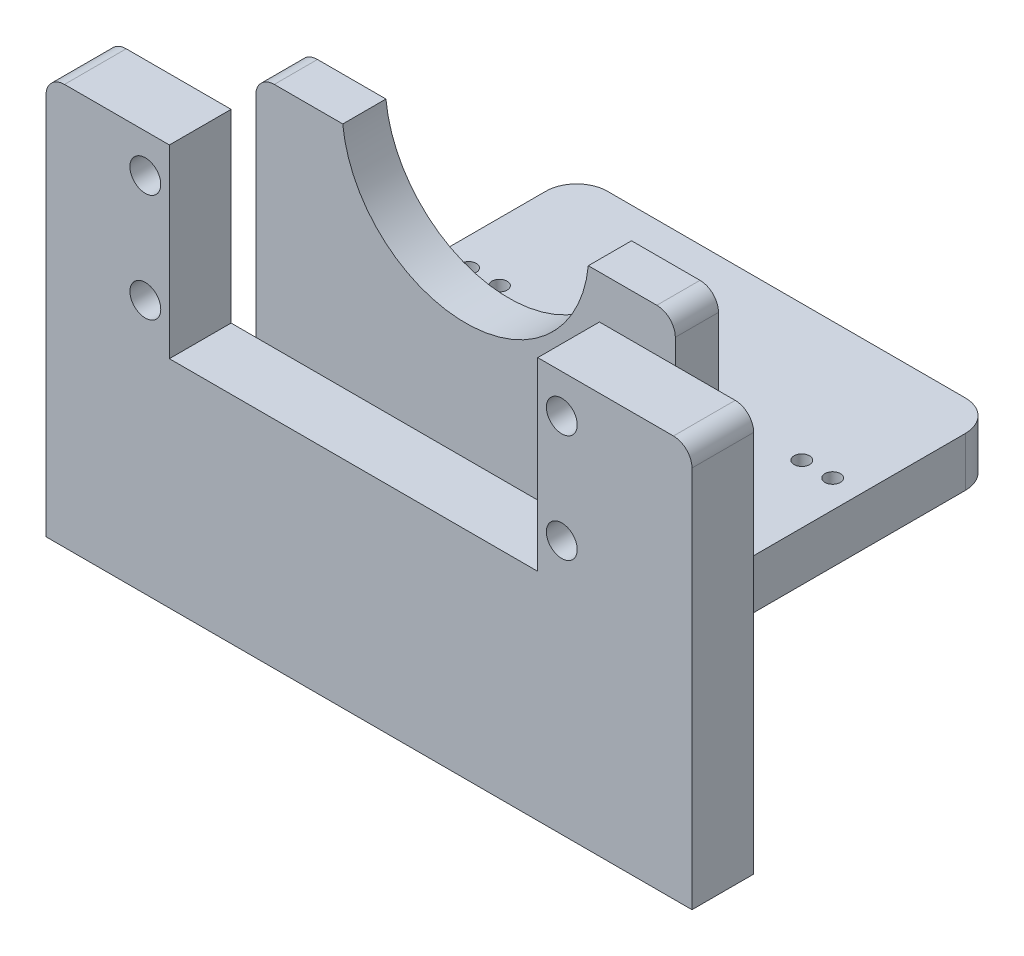
ISO-10303-21;
HEADER;
FILE_DESCRIPTION(('STEP AP214'),'2;1');
FILE_NAME('part.step','',(''),(''),'','','');
FILE_SCHEMA(('AUTOMOTIVE_DESIGN { 1 0 10303 214 1 1 1 1 }'));
ENDSEC;
DATA;
#1=APPLICATION_CONTEXT('core data for automotive mechanical design processes');
#2=APPLICATION_PROTOCOL_DEFINITION('international standard','automotive_design',2000,#1);
#3=PRODUCT_CONTEXT('',#1,'mechanical');
#4=PRODUCT('Part','Part','',(#3));
#5=PRODUCT_RELATED_PRODUCT_CATEGORY('part','',(#4));
#6=PRODUCT_DEFINITION_FORMATION('','',#4);
#7=PRODUCT_DEFINITION_CONTEXT('part definition',#1,'design');
#8=PRODUCT_DEFINITION('design','',#6,#7);
#9=PRODUCT_DEFINITION_SHAPE('','',#8);
#10=(LENGTH_UNIT() NAMED_UNIT(*) SI_UNIT(.MILLI.,.METRE.));
#11=(NAMED_UNIT(*) PLANE_ANGLE_UNIT() SI_UNIT($,.RADIAN.));
#12=(NAMED_UNIT(*) SI_UNIT($,.STERADIAN.) SOLID_ANGLE_UNIT());
#13=UNCERTAINTY_MEASURE_WITH_UNIT(LENGTH_MEASURE(1.E-05),#10,'distance_accuracy_value','');
#14=(GEOMETRIC_REPRESENTATION_CONTEXT(3) GLOBAL_UNCERTAINTY_ASSIGNED_CONTEXT((#13)) GLOBAL_UNIT_ASSIGNED_CONTEXT((#10,
#11,#12)) REPRESENTATION_CONTEXT('',''));
#15=CARTESIAN_POINT('',(0.,0.,0.));
#16=DIRECTION('',(0.,0.,1.));
#17=DIRECTION('',(1.,0.,0.));
#18=AXIS2_PLACEMENT_3D('',#15,#16,#17);
#19=CARTESIAN_POINT('',(-30.4771972470644,6.0271819238043,-31.));
#20=DIRECTION('',(0.,0.,1.));
#21=DIRECTION('',(1.,0.,0.));
#22=AXIS2_PLACEMENT_3D('',#19,#20,#21);
#23=PLANE('',#22);
#24=DIRECTION('',(0.,-1.,0.));
#25=VECTOR('',#24,1.);
#26=CARTESIAN_POINT('',(-30.4771972470644,6.0271819238043,-31.));
#27=LINE('',#26,#25);
#28=CARTESIAN_POINT('',(-30.4771972470644,3.0271819238043,-31.));
#29=VERTEX_POINT('',#28);
#30=CARTESIAN_POINT('',(-30.4771972470644,-33.9728180761957,-31.));
#31=VERTEX_POINT('',#30);
#32=EDGE_CURVE('E258',#29,#31,#27,.T.);
#33=ORIENTED_EDGE('',*,*,#32,.F.);
#34=CARTESIAN_POINT('',(-27.4771972470644,3.0271819238043,-31.));
#35=DIRECTION('',(0.,0.,1.));
#36=DIRECTION('',(1.,0.,0.));
#37=AXIS2_PLACEMENT_3D('',#34,#35,#36);
#38=CIRCLE('',#37,3.);
#39=CARTESIAN_POINT('',(-27.4771972470644,6.0271819238043,-31.));
#40=VERTEX_POINT('',#39);
#41=EDGE_CURVE('E409',#29,#40,#38,.F.);
#42=ORIENTED_EDGE('',*,*,#41,.T.);
#43=DIRECTION('',(-1.,0.,0.));
#44=VECTOR('',#43,1.);
#45=CARTESIAN_POINT('',(-30.4771972470644,6.0271819238043,-31.));
#46=LINE('',#45,#44);
#47=CARTESIAN_POINT('',(-16.3769459891968,6.0271819238043,-31.));
#48=VERTEX_POINT('',#47);
#49=EDGE_CURVE('E254',#48,#40,#46,.T.);
#50=ORIENTED_EDGE('',*,*,#49,.F.);
#51=CARTESIAN_POINT('',(3.52280275293562,8.0271819238043,-31.));
#52=DIRECTION('',(0.,0.,1.));
#53=DIRECTION('',(1.,0.,0.));
#54=AXIS2_PLACEMENT_3D('',#51,#52,#53);
#55=CIRCLE('',#54,20.);
#56=CARTESIAN_POINT('',(23.422551495068,6.0271819238043,-31.));
#57=VERTEX_POINT('',#56);
#58=EDGE_CURVE('E248',#48,#57,#55,.T.);
#59=ORIENTED_EDGE('',*,*,#58,.T.);
#60=CARTESIAN_POINT('',(34.522551495068,6.0271819238043,-31.));
#61=VERTEX_POINT('',#60);
#62=EDGE_CURVE('E256',#61,#57,#46,.T.);
#63=ORIENTED_EDGE('',*,*,#62,.F.);
#64=CARTESIAN_POINT('',(34.522551495068,3.0271819238043,-31.));
#65=DIRECTION('',(0.,0.,1.));
#66=DIRECTION('',(1.,0.,0.));
#67=AXIS2_PLACEMENT_3D('',#64,#65,#66);
#68=CIRCLE('',#67,3.);
#69=CARTESIAN_POINT('',(37.522551495068,3.0271819238043,-31.));
#70=VERTEX_POINT('',#69);
#71=EDGE_CURVE('E50',#61,#70,#68,.F.);
#72=ORIENTED_EDGE('',*,*,#71,.T.);
#73=DIRECTION('',(0.,-1.,0.));
#74=VECTOR('',#73,1.);
#75=CARTESIAN_POINT('',(37.522551495068,6.0271819238043,-31.));
#76=LINE('',#75,#74);
#77=CARTESIAN_POINT('',(37.522551495068,-33.9728180761957,-31.));
#78=VERTEX_POINT('',#77);
#79=EDGE_CURVE('E196',#70,#78,#76,.T.);
#80=ORIENTED_EDGE('',*,*,#79,.T.);
#81=DIRECTION('',(1.,0.,0.));
#82=VECTOR('',#81,1.);
#83=CARTESIAN_POINT('',(37.522551495068,-33.9728180761957,-31.));
#84=LINE('',#83,#82);
#85=EDGE_CURVE('E200',#31,#78,#84,.T.);
#86=ORIENTED_EDGE('',*,*,#85,.F.);
#87=EDGE_LOOP('',(#33,#42,#50,#59,#63,#72,#80,#86));
#88=FACE_BOUND('',#87,.T.);
#89=ADVANCED_FACE('F35',(#88),#23,.F.);
#90=CARTESIAN_POINT('',(0.,6.0271819238043,0.));
#91=DIRECTION('',(0.,1.,0.));
#92=DIRECTION('',(0.,0.,1.));
#93=AXIS2_PLACEMENT_3D('',#90,#91,#92);
#94=PLANE('',#93);
#95=ORIENTED_EDGE('',*,*,#49,.T.);
#96=DIRECTION('',(0.,0.,1.));
#97=VECTOR('',#96,1.);
#98=CARTESIAN_POINT('',(-27.4771972470644,6.0271819238043,0.));
#99=LINE('',#98,#97);
#100=CARTESIAN_POINT('',(-27.4771972470644,6.0271819238043,-24.));
#101=VERTEX_POINT('',#100);
#102=EDGE_CURVE('E399',#40,#101,#99,.T.);
#103=ORIENTED_EDGE('',*,*,#102,.T.);
#104=DIRECTION('',(1.,0.,0.));
#105=VECTOR('',#104,1.);
#106=CARTESIAN_POINT('',(-30.4771972470644,6.0271819238043,-24.));
#107=LINE('',#106,#105);
#108=CARTESIAN_POINT('',(-16.3769459891968,6.0271819238043,-24.));
#109=VERTEX_POINT('',#108);
#110=EDGE_CURVE('E252',#101,#109,#107,.T.);
#111=ORIENTED_EDGE('',*,*,#110,.T.);
#112=DIRECTION('',(0.,0.,1.));
#113=VECTOR('',#112,1.);
#114=CARTESIAN_POINT('',(-16.3769459891968,6.0271819238043,-45.));
#115=LINE('',#114,#113);
#116=EDGE_CURVE('E351',#48,#109,#115,.T.);
#117=ORIENTED_EDGE('',*,*,#116,.F.);
#118=EDGE_LOOP('',(#95,#103,#111,#117));
#119=FACE_BOUND('',#118,.T.);
#120=ADVANCED_FACE('F492',(#119),#94,.T.);
#121=CARTESIAN_POINT('',(74.2228027529356,-33.9728180761957,-45.));
#122=DIRECTION('',(0.,-1.,0.));
#123=DIRECTION('',(0.,0.,-1.));
#124=AXIS2_PLACEMENT_3D('',#121,#122,#123);
#125=PLANE('',#124);
#126=DIRECTION('',(1.,0.,0.));
#127=VECTOR('',#126,1.);
#128=CARTESIAN_POINT('',(74.2228027529356,-33.9728180761957,0.));
#129=LINE('',#128,#127);
#130=CARTESIAN_POINT('',(-30.4771972470644,-33.9728180761957,0.));
#131=VERTEX_POINT('',#130);
#132=CARTESIAN_POINT('',(74.2228027529356,-33.9728180761957,0.));
#133=VERTEX_POINT('',#132);
#134=EDGE_CURVE('E264',#131,#133,#129,.T.);
#135=ORIENTED_EDGE('',*,*,#134,.T.);
#136=DIRECTION('',(-0.925206505756551,0.,-0.379463992634023));
#137=VECTOR('',#136,1.);
#138=CARTESIAN_POINT('',(58.4240877920947,-33.9728180761957,-6.47968147675893));
#139=LINE('',#138,#137);
#140=CARTESIAN_POINT('',(40.6252315318979,-33.9728180761957,-13.7797004658067));
#141=VERTEX_POINT('',#140);
#142=EDGE_CURVE('E243',#133,#141,#139,.T.);
#143=ORIENTED_EDGE('',*,*,#142,.T.);
#144=CARTESIAN_POINT('',(42.522551495068,-33.9728180761957,-18.4057329945895));
#145=DIRECTION('',(0.,-1.,0.));
#146=DIRECTION('',(0.,0.,-1.));
#147=AXIS2_PLACEMENT_3D('',#144,#145,#146);
#148=CIRCLE('',#147,5.);
#149=CARTESIAN_POINT('',(37.522551495068,-33.9728180761957,-18.4057329945895));
#150=VERTEX_POINT('',#149);
#151=EDGE_CURVE('E378',#141,#150,#148,.T.);
#152=ORIENTED_EDGE('',*,*,#151,.T.);
#153=DIRECTION('',(0.,0.,-1.));
#154=VECTOR('',#153,1.);
#155=CARTESIAN_POINT('',(37.522551495068,-33.9728180761957,-45.));
#156=LINE('',#155,#154);
#157=CARTESIAN_POINT('',(37.522551495068,-33.9728180761957,-24.));
#158=VERTEX_POINT('',#157);
#159=EDGE_CURVE('E241',#150,#158,#156,.T.);
#160=ORIENTED_EDGE('',*,*,#159,.T.);
#161=DIRECTION('',(1.,0.,0.));
#162=VECTOR('',#161,1.);
#163=CARTESIAN_POINT('',(-30.4771972470644,-33.9728180761957,-24.));
#164=LINE('',#163,#162);
#165=CARTESIAN_POINT('',(-30.4771972470644,-33.9728180761957,-24.));
#166=VERTEX_POINT('',#165);
#167=EDGE_CURVE('E251',#166,#158,#164,.T.);
#168=ORIENTED_EDGE('',*,*,#167,.F.);
#169=DIRECTION('',(0.,0.,1.));
#170=VECTOR('',#169,1.);
#171=CARTESIAN_POINT('',(-30.4771972470644,-33.9728180761957,-45.));
#172=LINE('',#171,#170);
#173=EDGE_CURVE('E267',#166,#131,#172,.T.);
#174=ORIENTED_EDGE('',*,*,#173,.T.);
#175=EDGE_LOOP('',(#135,#143,#152,#160,#168,#174));
#176=FACE_BOUND('',#175,.T.);
#177=ADVANCED_FACE('F421',(#176),#125,.F.);
#178=CARTESIAN_POINT('',(0.,0.,0.));
#179=DIRECTION('',(0.,0.,1.));
#180=DIRECTION('',(1.,0.,0.));
#181=AXIS2_PLACEMENT_3D('',#178,#179,#180);
#182=PLANE('',#181);
#183=CARTESIAN_POINT('',(53.1228027529356,-0.722818076195696,0.));
#184=DIRECTION('',(0.,0.,1.));
#185=DIRECTION('',(1.,0.,0.));
#186=AXIS2_PLACEMENT_3D('',#183,#184,#185);
#187=CIRCLE('',#186,2.5);
#188=CARTESIAN_POINT('',(55.6228027529356,-0.722818076195696,0.));
#189=VERTEX_POINT('',#188);
#190=EDGE_CURVE('E274',#189,#189,#187,.F.);
#191=ORIENTED_EDGE('',*,*,#190,.F.);
#192=EDGE_LOOP('',(#191));
#193=FACE_BOUND('',#192,.T.);
#194=CARTESIAN_POINT('',(53.1228027529356,16.7771819238043,0.));
#195=DIRECTION('',(0.,0.,1.));
#196=DIRECTION('',(1.,0.,0.));
#197=AXIS2_PLACEMENT_3D('',#194,#195,#196);
#198=CIRCLE('',#197,2.5);
#199=CARTESIAN_POINT('',(55.6228027529356,16.7771819238043,0.));
#200=VERTEX_POINT('',#199);
#201=EDGE_CURVE('E328',#200,#200,#198,.T.);
#202=ORIENTED_EDGE('',*,*,#201,.T.);
#203=EDGE_LOOP('',(#202));
#204=FACE_BOUND('',#203,.T.);
#205=CARTESIAN_POINT('',(-14.3771972470644,-0.722818076195696,0.));
#206=DIRECTION('',(0.,0.,1.));
#207=DIRECTION('',(1.,0.,0.));
#208=AXIS2_PLACEMENT_3D('',#205,#206,#207);
#209=CIRCLE('',#208,2.5);
#210=CARTESIAN_POINT('',(-11.8771972470644,-0.722818076195696,0.));
#211=VERTEX_POINT('',#210);
#212=EDGE_CURVE('E325',#211,#211,#209,.T.);
#213=ORIENTED_EDGE('',*,*,#212,.T.);
#214=EDGE_LOOP('',(#213));
#215=FACE_BOUND('',#214,.T.);
#216=CARTESIAN_POINT('',(-14.3771972470644,16.7771819238043,0.));
#217=DIRECTION('',(0.,0.,1.));
#218=DIRECTION('',(1.,0.,0.));
#219=AXIS2_PLACEMENT_3D('',#216,#217,#218);
#220=CIRCLE('',#219,2.5);
#221=CARTESIAN_POINT('',(-11.8771972470644,16.7771819238043,0.));
#222=VERTEX_POINT('',#221);
#223=EDGE_CURVE('E269',#222,#222,#220,.F.);
#224=ORIENTED_EDGE('',*,*,#223,.F.);
#225=EDGE_LOOP('',(#224));
#226=FACE_BOUND('',#225,.T.);
#227=DIRECTION('',(-1.,0.,0.));
#228=VECTOR('',#227,1.);
#229=CARTESIAN_POINT('',(0.,23.0271819238043,0.));
#230=LINE('',#229,#228);
#231=CARTESIAN_POINT('',(71.2228027529356,23.0271819238043,0.));
#232=VERTEX_POINT('',#231);
#233=CARTESIAN_POINT('',(49.2228027529356,23.0271819238043,0.));
#234=VERTEX_POINT('',#233);
#235=EDGE_CURVE('E323',#232,#234,#230,.T.);
#236=ORIENTED_EDGE('',*,*,#235,.F.);
#237=CARTESIAN_POINT('',(71.2228027529356,20.0271819238043,0.));
#238=DIRECTION('',(0.,0.,1.));
#239=DIRECTION('',(1.,0.,0.));
#240=AXIS2_PLACEMENT_3D('',#237,#238,#239);
#241=CIRCLE('',#240,3.);
#242=CARTESIAN_POINT('',(74.2228027529356,20.0271819238043,0.));
#243=VERTEX_POINT('',#242);
#244=EDGE_CURVE('E359',#232,#243,#241,.F.);
#245=ORIENTED_EDGE('',*,*,#244,.T.);
#246=DIRECTION('',(0.,-1.,0.));
#247=VECTOR('',#246,1.);
#248=CARTESIAN_POINT('',(74.2228027529356,0.,0.));
#249=LINE('',#248,#247);
#250=EDGE_CURVE('E321',#243,#133,#249,.T.);
#251=ORIENTED_EDGE('',*,*,#250,.T.);
#252=ORIENTED_EDGE('',*,*,#134,.F.);
#253=DIRECTION('',(0.,1.,0.));
#254=VECTOR('',#253,1.);
#255=CARTESIAN_POINT('',(-30.4771972470644,0.,0.));
#256=LINE('',#255,#254);
#257=CARTESIAN_POINT('',(-30.4771972470644,20.0271819238043,0.));
#258=VERTEX_POINT('',#257);
#259=EDGE_CURVE('E318',#131,#258,#256,.T.);
#260=ORIENTED_EDGE('',*,*,#259,.T.);
#261=CARTESIAN_POINT('',(-27.4771972470644,20.0271819238043,0.));
#262=DIRECTION('',(0.,0.,1.));
#263=DIRECTION('',(1.,0.,0.));
#264=AXIS2_PLACEMENT_3D('',#261,#262,#263);
#265=CIRCLE('',#264,3.);
#266=CARTESIAN_POINT('',(-27.4771972470644,23.0271819238043,0.));
#267=VERTEX_POINT('',#266);
#268=EDGE_CURVE('E357',#258,#267,#265,.F.);
#269=ORIENTED_EDGE('',*,*,#268,.T.);
#270=DIRECTION('',(1.,0.,0.));
#271=VECTOR('',#270,1.);
#272=CARTESIAN_POINT('',(0.,23.0271819238043,0.));
#273=LINE('',#272,#271);
#274=CARTESIAN_POINT('',(-10.4771972470644,23.0271819238043,0.));
#275=VERTEX_POINT('',#274);
#276=EDGE_CURVE('E316',#267,#275,#273,.T.);
#277=ORIENTED_EDGE('',*,*,#276,.T.);
#278=DIRECTION('',(0.,-1.,0.));
#279=VECTOR('',#278,1.);
#280=CARTESIAN_POINT('',(-10.4771972470644,0.,0.));
#281=LINE('',#280,#279);
#282=CARTESIAN_POINT('',(-10.4771972470644,-6.9728180761957,0.));
#283=VERTEX_POINT('',#282);
#284=EDGE_CURVE('E313',#275,#283,#281,.T.);
#285=ORIENTED_EDGE('',*,*,#284,.T.);
#286=DIRECTION('',(1.,0.,0.));
#287=VECTOR('',#286,1.);
#288=CARTESIAN_POINT('',(0.,-6.9728180761957,0.));
#289=LINE('',#288,#287);
#290=CARTESIAN_POINT('',(49.2228027529356,-6.9728180761957,0.));
#291=VERTEX_POINT('',#290);
#292=EDGE_CURVE('E310',#283,#291,#289,.T.);
#293=ORIENTED_EDGE('',*,*,#292,.T.);
#294=DIRECTION('',(0.,1.,0.));
#295=VECTOR('',#294,1.);
#296=CARTESIAN_POINT('',(49.2228027529356,0.,0.));
#297=LINE('',#296,#295);
#298=EDGE_CURVE('E307',#291,#234,#297,.T.);
#299=ORIENTED_EDGE('',*,*,#298,.T.);
#300=EDGE_LOOP('',(#236,#245,#251,#252,#260,#269,#277,#285,#293,#299));
#301=FACE_BOUND('',#300,.T.);
#302=ADVANCED_FACE('F430',(#193,#204,#215,#226,#301),#182,.F.);
#303=CARTESIAN_POINT('',(49.2228027529356,0.,10.));
#304=DIRECTION('',(-1.,0.,0.));
#305=DIRECTION('',(0.,0.,1.));
#306=AXIS2_PLACEMENT_3D('',#303,#304,#305);
#307=PLANE('',#306);
#308=ORIENTED_EDGE('',*,*,#298,.F.);
#309=DIRECTION('',(0.,0.,-1.));
#310=VECTOR('',#309,1.);
#311=CARTESIAN_POINT('',(49.2228027529356,-6.9728180761957,10.));
#312=LINE('',#311,#310);
#313=CARTESIAN_POINT('',(49.2228027529356,-6.9728180761957,10.));
#314=VERTEX_POINT('',#313);
#315=EDGE_CURVE('E346',#314,#291,#312,.T.);
#316=ORIENTED_EDGE('',*,*,#315,.F.);
#317=DIRECTION('',(0.,1.,0.));
#318=VECTOR('',#317,1.);
#319=CARTESIAN_POINT('',(49.2228027529356,0.,10.));
#320=LINE('',#319,#318);
#321=CARTESIAN_POINT('',(49.2228027529356,23.0271819238043,10.));
#322=VERTEX_POINT('',#321);
#323=EDGE_CURVE('E273',#314,#322,#320,.T.);
#324=ORIENTED_EDGE('',*,*,#323,.T.);
#325=DIRECTION('',(0.,0.,-1.));
#326=VECTOR('',#325,1.);
#327=CARTESIAN_POINT('',(49.2228027529356,23.0271819238043,10.));
#328=LINE('',#327,#326);
#329=EDGE_CURVE('E304',#322,#234,#328,.T.);
#330=ORIENTED_EDGE('',*,*,#329,.T.);
#331=EDGE_LOOP('',(#308,#316,#324,#330));
#332=FACE_BOUND('',#331,.T.);
#333=ADVANCED_FACE('F471',(#332),#307,.T.);
#334=CARTESIAN_POINT('',(0.,-6.9728180761957,10.));
#335=DIRECTION('',(0.,1.,0.));
#336=DIRECTION('',(0.,0.,1.));
#337=AXIS2_PLACEMENT_3D('',#334,#335,#336);
#338=PLANE('',#337);
#339=ORIENTED_EDGE('',*,*,#292,.F.);
#340=DIRECTION('',(0.,0.,-1.));
#341=VECTOR('',#340,1.);
#342=CARTESIAN_POINT('',(-10.4771972470644,-6.9728180761957,10.));
#343=LINE('',#342,#341);
#344=CARTESIAN_POINT('',(-10.4771972470644,-6.9728180761957,10.));
#345=VERTEX_POINT('',#344);
#346=EDGE_CURVE('E344',#345,#283,#343,.T.);
#347=ORIENTED_EDGE('',*,*,#346,.F.);
#348=DIRECTION('',(1.,0.,0.));
#349=VECTOR('',#348,1.);
#350=CARTESIAN_POINT('',(0.,-6.9728180761957,10.));
#351=LINE('',#350,#349);
#352=EDGE_CURVE('E277',#345,#314,#351,.T.);
#353=ORIENTED_EDGE('',*,*,#352,.T.);
#354=ORIENTED_EDGE('',*,*,#315,.T.);
#355=EDGE_LOOP('',(#339,#347,#353,#354));
#356=FACE_BOUND('',#355,.T.);
#357=ADVANCED_FACE('F469',(#356),#338,.T.);
#358=CARTESIAN_POINT('',(-10.4771972470644,0.,10.));
#359=DIRECTION('',(1.,0.,0.));
#360=DIRECTION('',(0.,1.,0.));
#361=AXIS2_PLACEMENT_3D('',#358,#359,#360);
#362=PLANE('',#361);
#363=ORIENTED_EDGE('',*,*,#284,.F.);
#364=DIRECTION('',(0.,0.,-1.));
#365=VECTOR('',#364,1.);
#366=CARTESIAN_POINT('',(-10.4771972470644,23.0271819238043,10.));
#367=LINE('',#366,#365);
#368=CARTESIAN_POINT('',(-10.4771972470644,23.0271819238043,10.));
#369=VERTEX_POINT('',#368);
#370=EDGE_CURVE('E341',#369,#275,#367,.T.);
#371=ORIENTED_EDGE('',*,*,#370,.F.);
#372=DIRECTION('',(0.,-1.,0.));
#373=VECTOR('',#372,1.);
#374=CARTESIAN_POINT('',(-10.4771972470644,0.,10.));
#375=LINE('',#374,#373);
#376=EDGE_CURVE('E280',#369,#345,#375,.T.);
#377=ORIENTED_EDGE('',*,*,#376,.T.);
#378=ORIENTED_EDGE('',*,*,#346,.T.);
#379=EDGE_LOOP('',(#363,#371,#377,#378));
#380=FACE_BOUND('',#379,.T.);
#381=ADVANCED_FACE('F465',(#380),#362,.T.);
#382=CARTESIAN_POINT('',(0.,23.0271819238043,10.));
#383=DIRECTION('',(0.,1.,0.));
#384=DIRECTION('',(-1.,0.,0.));
#385=AXIS2_PLACEMENT_3D('',#382,#383,#384);
#386=PLANE('',#385);
#387=ORIENTED_EDGE('',*,*,#276,.F.);
#388=DIRECTION('',(0.,0.,-1.));
#389=VECTOR('',#388,1.);
#390=CARTESIAN_POINT('',(-27.4771972470644,23.0271819238043,10.));
#391=LINE('',#390,#389);
#392=CARTESIAN_POINT('',(-27.4771972470644,23.0271819238043,10.));
#393=VERTEX_POINT('',#392);
#394=EDGE_CURVE('E370',#267,#393,#391,.F.);
#395=ORIENTED_EDGE('',*,*,#394,.T.);
#396=DIRECTION('',(1.,0.,0.));
#397=VECTOR('',#396,1.);
#398=CARTESIAN_POINT('',(0.,23.0271819238043,10.));
#399=LINE('',#398,#397);
#400=EDGE_CURVE('E283',#393,#369,#399,.T.);
#401=ORIENTED_EDGE('',*,*,#400,.T.);
#402=ORIENTED_EDGE('',*,*,#370,.T.);
#403=EDGE_LOOP('',(#387,#395,#401,#402));
#404=FACE_BOUND('',#403,.T.);
#405=ADVANCED_FACE('F458',(#404),#386,.T.);
#406=CARTESIAN_POINT('',(-30.4771972470644,0.,10.));
#407=DIRECTION('',(-1.,0.,0.));
#408=DIRECTION('',(0.,0.,1.));
#409=AXIS2_PLACEMENT_3D('',#406,#407,#408);
#410=PLANE('',#409);
#411=DIRECTION('',(0.,-1.,0.));
#412=VECTOR('',#411,1.);
#413=CARTESIAN_POINT('',(-30.4771972470644,6.0271819238043,-24.));
#414=LINE('',#413,#412);
#415=CARTESIAN_POINT('',(-30.4771972470644,3.0271819238043,-24.));
#416=VERTEX_POINT('',#415);
#417=EDGE_CURVE('E262',#416,#166,#414,.T.);
#418=ORIENTED_EDGE('',*,*,#417,.F.);
#419=DIRECTION('',(0.,0.,1.));
#420=VECTOR('',#419,1.);
#421=CARTESIAN_POINT('',(-30.4771972470644,3.0271819238043,10.));
#422=LINE('',#421,#420);
#423=EDGE_CURVE('E406',#416,#29,#422,.F.);
#424=ORIENTED_EDGE('',*,*,#423,.T.);
#425=ORIENTED_EDGE('',*,*,#32,.T.);
#426=DIRECTION('',(0.,0.,1.));
#427=VECTOR('',#426,1.);
#428=CARTESIAN_POINT('',(-30.4771972470644,-33.9728180761957,-76.));
#429=LINE('',#428,#427);
#430=CARTESIAN_POINT('',(-30.4771972470644,-33.9728180761957,-71.));
#431=VERTEX_POINT('',#430);
#432=EDGE_CURVE('E215',#431,#31,#429,.T.);
#433=ORIENTED_EDGE('',*,*,#432,.F.);
#434=DIRECTION('',(0.,1.,0.));
#435=VECTOR('',#434,1.);
#436=CARTESIAN_POINT('',(-30.4771972470644,0.,-71.));
#437=LINE('',#436,#435);
#438=CARTESIAN_POINT('',(-30.4771972470644,-41.9728180761957,-71.));
#439=VERTEX_POINT('',#438);
#440=EDGE_CURVE('E392',#431,#439,#437,.F.);
#441=ORIENTED_EDGE('',*,*,#440,.T.);
#442=DIRECTION('',(0.,0.,-1.));
#443=VECTOR('',#442,1.);
#444=CARTESIAN_POINT('',(-30.4771972470644,-41.9728180761957,10.));
#445=LINE('',#444,#443);
#446=CARTESIAN_POINT('',(-30.4771972470644,-41.9728180761957,10.));
#447=VERTEX_POINT('',#446);
#448=EDGE_CURVE('E338',#447,#439,#445,.T.);
#449=ORIENTED_EDGE('',*,*,#448,.F.);
#450=DIRECTION('',(0.,1.,0.));
#451=VECTOR('',#450,1.);
#452=CARTESIAN_POINT('',(-30.4771972470644,0.,10.));
#453=LINE('',#452,#451);
#454=CARTESIAN_POINT('',(-30.4771972470644,20.0271819238043,10.));
#455=VERTEX_POINT('',#454);
#456=EDGE_CURVE('E285',#447,#455,#453,.T.);
#457=ORIENTED_EDGE('',*,*,#456,.T.);
#458=DIRECTION('',(0.,0.,-1.));
#459=VECTOR('',#458,1.);
#460=CARTESIAN_POINT('',(-30.4771972470644,20.0271819238043,10.));
#461=LINE('',#460,#459);
#462=EDGE_CURVE('E367',#455,#258,#461,.T.);
#463=ORIENTED_EDGE('',*,*,#462,.T.);
#464=ORIENTED_EDGE('',*,*,#259,.F.);
#465=ORIENTED_EDGE('',*,*,#173,.F.);
#466=EDGE_LOOP('',(#418,#424,#425,#433,#441,#449,#457,#463,#464,#465));
#467=FACE_BOUND('',#466,.T.);
#468=ADVANCED_FACE('F425',(#467),#410,.T.);
#469=CARTESIAN_POINT('',(0.,-41.9728180761957,10.));
#470=DIRECTION('',(0.,-1.,0.));
#471=DIRECTION('',(1.,0.,0.));
#472=AXIS2_PLACEMENT_3D('',#469,#470,#471);
#473=PLANE('',#472);
#474=CARTESIAN_POINT('',(-20.9771972470644,-41.9728180761957,-54.));
#475=DIRECTION('',(0.,-1.,0.));
#476=DIRECTION('',(1.,0.,0.));
#477=AXIS2_PLACEMENT_3D('',#474,#475,#476);
#478=CIRCLE('',#477,1.25);
#479=CARTESIAN_POINT('',(-19.7271972470644,-41.9728180761957,-54.));
#480=VERTEX_POINT('',#479);
#481=EDGE_CURVE('E840',#480,#480,#478,.F.);
#482=ORIENTED_EDGE('',*,*,#481,.T.);
#483=EDGE_LOOP('',(#482));
#484=FACE_BOUND('',#483,.T.);
#485=CARTESIAN_POINT('',(33.0228027529356,-41.9728180761957,-54.));
#486=DIRECTION('',(0.,-1.,0.));
#487=DIRECTION('',(1.,0.,0.));
#488=AXIS2_PLACEMENT_3D('',#485,#486,#487);
#489=CIRCLE('',#488,1.25);
#490=CARTESIAN_POINT('',(34.2728027529356,-41.9728180761957,-54.));
#491=VERTEX_POINT('',#490);
#492=EDGE_CURVE('E848',#491,#491,#489,.F.);
#493=ORIENTED_EDGE('',*,*,#492,.T.);
#494=EDGE_LOOP('',(#493));
#495=FACE_BOUND('',#494,.T.);
#496=CARTESIAN_POINT('',(-25.9771972470644,-41.9728180761957,-54.));
#497=DIRECTION('',(0.,-1.,0.));
#498=DIRECTION('',(1.,0.,0.));
#499=AXIS2_PLACEMENT_3D('',#496,#497,#498);
#500=CIRCLE('',#499,1.25);
#501=CARTESIAN_POINT('',(-24.7271972470644,-41.9728180761957,-54.));
#502=VERTEX_POINT('',#501);
#503=EDGE_CURVE('E844',#502,#502,#500,.F.);
#504=ORIENTED_EDGE('',*,*,#503,.T.);
#505=EDGE_LOOP('',(#504));
#506=FACE_BOUND('',#505,.T.);
#507=CARTESIAN_POINT('',(28.0228027529356,-41.9728180761957,-54.));
#508=DIRECTION('',(0.,-1.,0.));
#509=DIRECTION('',(1.,0.,0.));
#510=AXIS2_PLACEMENT_3D('',#507,#508,#509);
#511=CIRCLE('',#510,1.25);
#512=CARTESIAN_POINT('',(29.2728027529356,-41.9728180761957,-54.));
#513=VERTEX_POINT('',#512);
#514=EDGE_CURVE('E833',#513,#513,#511,.F.);
#515=ORIENTED_EDGE('',*,*,#514,.T.);
#516=EDGE_LOOP('',(#515));
#517=FACE_BOUND('',#516,.T.);
#518=CARTESIAN_POINT('',(3.52280275293562,-41.9728180761957,-54.));
#519=DIRECTION('',(0.,-1.,0.));
#520=DIRECTION('',(1.,0.,0.));
#521=AXIS2_PLACEMENT_3D('',#518,#519,#520);
#522=CIRCLE('',#521,6.5);
#523=CARTESIAN_POINT('',(10.0228027529356,-41.9728180761957,-54.));
#524=VERTEX_POINT('',#523);
#525=EDGE_CURVE('E228',#524,#524,#522,.F.);
#526=ORIENTED_EDGE('',*,*,#525,.T.);
#527=EDGE_LOOP('',(#526));
#528=FACE_BOUND('',#527,.T.);
#529=ORIENTED_EDGE('',*,*,#448,.T.);
#530=CARTESIAN_POINT('',(-25.4771972470644,-41.9728180761957,-71.));
#531=DIRECTION('',(0.,-1.,0.));
#532=DIRECTION('',(1.,0.,0.));
#533=AXIS2_PLACEMENT_3D('',#530,#531,#532);
#534=CIRCLE('',#533,5.);
#535=CARTESIAN_POINT('',(-25.4771972470644,-41.9728180761957,-76.));
#536=VERTEX_POINT('',#535);
#537=EDGE_CURVE('E396',#439,#536,#534,.T.);
#538=ORIENTED_EDGE('',*,*,#537,.T.);
#539=DIRECTION('',(-1.,0.,0.));
#540=VECTOR('',#539,1.);
#541=CARTESIAN_POINT('',(37.522551495068,-41.9728180761957,-76.));
#542=LINE('',#541,#540);
#543=CARTESIAN_POINT('',(32.522551495068,-41.9728180761957,-76.));
#544=VERTEX_POINT('',#543);
#545=EDGE_CURVE('E222',#544,#536,#542,.T.);
#546=ORIENTED_EDGE('',*,*,#545,.F.);
#547=CARTESIAN_POINT('',(32.522551495068,-41.9728180761957,-71.));
#548=DIRECTION('',(0.,-1.,0.));
#549=DIRECTION('',(1.,0.,0.));
#550=AXIS2_PLACEMENT_3D('',#547,#548,#549);
#551=CIRCLE('',#550,5.);
#552=CARTESIAN_POINT('',(37.522551495068,-41.9728180761957,-71.));
#553=VERTEX_POINT('',#552);
#554=EDGE_CURVE('E394',#544,#553,#551,.T.);
#555=ORIENTED_EDGE('',*,*,#554,.T.);
#556=DIRECTION('',(0.,0.,1.));
#557=VECTOR('',#556,1.);
#558=CARTESIAN_POINT('',(37.522551495068,-41.9728180761957,-45.));
#559=LINE('',#558,#557);
#560=CARTESIAN_POINT('',(37.522551495068,-41.9728180761957,-18.4057329945895));
#561=VERTEX_POINT('',#560);
#562=EDGE_CURVE('E233',#553,#561,#559,.T.);
#563=ORIENTED_EDGE('',*,*,#562,.T.);
#564=CARTESIAN_POINT('',(42.522551495068,-41.9728180761957,-18.4057329945895));
#565=DIRECTION('',(0.,-1.,0.));
#566=DIRECTION('',(1.,0.,0.));
#567=AXIS2_PLACEMENT_3D('',#564,#565,#566);
#568=CIRCLE('',#567,5.);
#569=CARTESIAN_POINT('',(40.6252315318979,-41.9728180761957,-13.7797004658067));
#570=VERTEX_POINT('',#569);
#571=EDGE_CURVE('E380',#561,#570,#568,.F.);
#572=ORIENTED_EDGE('',*,*,#571,.T.);
#573=DIRECTION('',(0.925206505756551,0.,0.379463992634023));
#574=VECTOR('',#573,1.);
#575=CARTESIAN_POINT('',(37.522551495068,-41.9728180761957,-15.0522329732155));
#576=LINE('',#575,#574);
#577=CARTESIAN_POINT('',(74.2228027529356,-41.9728180761957,0.));
#578=VERTEX_POINT('',#577);
#579=EDGE_CURVE('E235',#570,#578,#576,.T.);
#580=ORIENTED_EDGE('',*,*,#579,.T.);
#581=DIRECTION('',(0.,0.,-1.));
#582=VECTOR('',#581,1.);
#583=CARTESIAN_POINT('',(74.2228027529356,-41.9728180761957,10.));
#584=LINE('',#583,#582);
#585=CARTESIAN_POINT('',(74.2228027529356,-41.9728180761957,10.));
#586=VERTEX_POINT('',#585);
#587=EDGE_CURVE('E335',#586,#578,#584,.T.);
#588=ORIENTED_EDGE('',*,*,#587,.F.);
#589=DIRECTION('',(-1.,0.,0.));
#590=VECTOR('',#589,1.);
#591=CARTESIAN_POINT('',(0.,-41.9728180761957,10.));
#592=LINE('',#591,#590);
#593=EDGE_CURVE('E288',#586,#447,#592,.T.);
#594=ORIENTED_EDGE('',*,*,#593,.T.);
#595=EDGE_LOOP('',(#529,#538,#546,#555,#563,#572,#580,#588,#594));
#596=FACE_BOUND('',#595,.T.);
#597=ADVANCED_FACE('F446',(#484,#495,#506,#517,#528,#596),#473,.T.);
#598=CARTESIAN_POINT('',(74.2228027529356,0.,10.));
#599=DIRECTION('',(1.,0.,0.));
#600=DIRECTION('',(0.,1.,0.));
#601=AXIS2_PLACEMENT_3D('',#598,#599,#600);
#602=PLANE('',#601);
#603=DIRECTION('',(0.,1.,0.));
#604=VECTOR('',#603,1.);
#605=CARTESIAN_POINT('',(74.2228027529356,-41.9728180761957,0.));
#606=LINE('',#605,#604);
#607=EDGE_CURVE('E205',#578,#133,#606,.T.);
#608=ORIENTED_EDGE('',*,*,#607,.T.);
#609=ORIENTED_EDGE('',*,*,#250,.F.);
#610=DIRECTION('',(0.,0.,-1.));
#611=VECTOR('',#610,1.);
#612=CARTESIAN_POINT('',(74.2228027529356,20.0271819238043,10.));
#613=LINE('',#612,#611);
#614=CARTESIAN_POINT('',(74.2228027529356,20.0271819238043,10.));
#615=VERTEX_POINT('',#614);
#616=EDGE_CURVE('E361',#243,#615,#613,.F.);
#617=ORIENTED_EDGE('',*,*,#616,.T.);
#618=DIRECTION('',(0.,-1.,0.));
#619=VECTOR('',#618,1.);
#620=CARTESIAN_POINT('',(74.2228027529356,0.,10.));
#621=LINE('',#620,#619);
#622=EDGE_CURVE('E291',#615,#586,#621,.T.);
#623=ORIENTED_EDGE('',*,*,#622,.T.);
#624=ORIENTED_EDGE('',*,*,#587,.T.);
#625=EDGE_LOOP('',(#608,#609,#617,#623,#624));
#626=FACE_BOUND('',#625,.T.);
#627=ADVANCED_FACE('F440',(#626),#602,.T.);
#628=CARTESIAN_POINT('',(53.1228027529356,16.7771819238043,10.));
#629=DIRECTION('',(0.,0.,-1.));
#630=DIRECTION('',(-1.,0.,0.));
#631=AXIS2_PLACEMENT_3D('',#628,#629,#630);
#632=CYLINDRICAL_SURFACE('',#631,2.5);
#633=CARTESIAN_POINT('',(53.1228027529356,16.7771819238043,10.));
#634=DIRECTION('',(0.,0.,1.));
#635=DIRECTION('',(1.,0.,0.));
#636=AXIS2_PLACEMENT_3D('',#633,#634,#635);
#637=CIRCLE('',#636,2.5);
#638=CARTESIAN_POINT('',(55.6228027529356,16.7771819238043,10.));
#639=VERTEX_POINT('',#638);
#640=EDGE_CURVE('E298',#639,#639,#637,.T.);
#641=ORIENTED_EDGE('',*,*,#640,.T.);
#642=EDGE_LOOP('',(#641));
#643=FACE_BOUND('',#642,.T.);
#644=ORIENTED_EDGE('',*,*,#201,.F.);
#645=EDGE_LOOP('',(#644));
#646=FACE_BOUND('',#645,.T.);
#647=ADVANCED_FACE('F515',(#643,#646),#632,.F.);
#648=CARTESIAN_POINT('',(-14.3771972470644,-0.722818076195696,10.));
#649=DIRECTION('',(0.,0.,-1.));
#650=DIRECTION('',(-1.,0.,0.));
#651=AXIS2_PLACEMENT_3D('',#648,#649,#650);
#652=CYLINDRICAL_SURFACE('',#651,2.5);
#653=CARTESIAN_POINT('',(-14.3771972470644,-0.722818076195696,10.));
#654=DIRECTION('',(0.,0.,1.));
#655=DIRECTION('',(1.,0.,0.));
#656=AXIS2_PLACEMENT_3D('',#653,#654,#655);
#657=CIRCLE('',#656,2.5);
#658=CARTESIAN_POINT('',(-11.8771972470644,-0.722818076195696,10.));
#659=VERTEX_POINT('',#658);
#660=EDGE_CURVE('E295',#659,#659,#657,.T.);
#661=ORIENTED_EDGE('',*,*,#660,.T.);
#662=EDGE_LOOP('',(#661));
#663=FACE_BOUND('',#662,.T.);
#664=ORIENTED_EDGE('',*,*,#212,.F.);
#665=EDGE_LOOP('',(#664));
#666=FACE_BOUND('',#665,.T.);
#667=ADVANCED_FACE('F518',(#663,#666),#652,.F.);
#668=CARTESIAN_POINT('',(0.,23.0271819238043,10.));
#669=DIRECTION('',(0.,-1.,0.));
#670=DIRECTION('',(0.,0.,-1.));
#671=AXIS2_PLACEMENT_3D('',#668,#669,#670);
#672=PLANE('',#671);
#673=DIRECTION('',(-1.,0.,0.));
#674=VECTOR('',#673,1.);
#675=CARTESIAN_POINT('',(0.,23.0271819238043,10.));
#676=LINE('',#675,#674);
#677=CARTESIAN_POINT('',(71.2228027529356,23.0271819238043,10.));
#678=VERTEX_POINT('',#677);
#679=EDGE_CURVE('E293',#678,#322,#676,.T.);
#680=ORIENTED_EDGE('',*,*,#679,.F.);
#681=DIRECTION('',(0.,0.,-1.));
#682=VECTOR('',#681,1.);
#683=CARTESIAN_POINT('',(71.2228027529356,23.0271819238043,0.));
#684=LINE('',#683,#682);
#685=EDGE_CURVE('E354',#678,#232,#684,.T.);
#686=ORIENTED_EDGE('',*,*,#685,.T.);
#687=ORIENTED_EDGE('',*,*,#235,.T.);
#688=ORIENTED_EDGE('',*,*,#329,.F.);
#689=EDGE_LOOP('',(#680,#686,#687,#688));
#690=FACE_BOUND('',#689,.T.);
#691=ADVANCED_FACE('F475',(#690),#672,.F.);
#692=CARTESIAN_POINT('',(-14.3771972470644,16.7771819238043,10.));
#693=DIRECTION('',(0.,0.,-1.));
#694=DIRECTION('',(-1.,0.,0.));
#695=AXIS2_PLACEMENT_3D('',#692,#693,#694);
#696=CYLINDRICAL_SURFACE('',#695,2.5);
#697=CARTESIAN_POINT('',(-14.3771972470644,16.7771819238043,10.));
#698=DIRECTION('',(0.,0.,1.));
#699=DIRECTION('',(1.,0.,0.));
#700=AXIS2_PLACEMENT_3D('',#697,#698,#699);
#701=CIRCLE('',#700,2.5);
#702=CARTESIAN_POINT('',(-11.8771972470644,16.7771819238043,10.));
#703=VERTEX_POINT('',#702);
#704=EDGE_CURVE('E270',#703,#703,#701,.F.);
#705=ORIENTED_EDGE('',*,*,#704,.F.);
#706=EDGE_LOOP('',(#705));
#707=FACE_BOUND('',#706,.T.);
#708=ORIENTED_EDGE('',*,*,#223,.T.);
#709=EDGE_LOOP('',(#708));
#710=FACE_BOUND('',#709,.T.);
#711=ADVANCED_FACE('F513',(#707,#710),#696,.F.);
#712=CARTESIAN_POINT('',(53.1228027529356,-0.722818076195696,10.));
#713=DIRECTION('',(0.,0.,-1.));
#714=DIRECTION('',(-1.,0.,0.));
#715=AXIS2_PLACEMENT_3D('',#712,#713,#714);
#716=CYLINDRICAL_SURFACE('',#715,2.5);
#717=CARTESIAN_POINT('',(53.1228027529356,-0.722818076195696,10.));
#718=DIRECTION('',(0.,0.,1.));
#719=DIRECTION('',(1.,0.,0.));
#720=AXIS2_PLACEMENT_3D('',#717,#718,#719);
#721=CIRCLE('',#720,2.5);
#722=CARTESIAN_POINT('',(55.6228027529356,-0.722818076195696,10.));
#723=VERTEX_POINT('',#722);
#724=EDGE_CURVE('E301',#723,#723,#721,.F.);
#725=ORIENTED_EDGE('',*,*,#724,.F.);
#726=EDGE_LOOP('',(#725));
#727=FACE_BOUND('',#726,.T.);
#728=ORIENTED_EDGE('',*,*,#190,.T.);
#729=EDGE_LOOP('',(#728));
#730=FACE_BOUND('',#729,.T.);
#731=ADVANCED_FACE('F506',(#727,#730),#716,.F.);
#732=CARTESIAN_POINT('',(0.,0.,10.));
#733=DIRECTION('',(0.,0.,1.));
#734=DIRECTION('',(1.,0.,0.));
#735=AXIS2_PLACEMENT_3D('',#732,#733,#734);
#736=PLANE('',#735);
#737=ORIENTED_EDGE('',*,*,#704,.T.);
#738=EDGE_LOOP('',(#737));
#739=FACE_BOUND('',#738,.T.);
#740=ORIENTED_EDGE('',*,*,#622,.F.);
#741=CARTESIAN_POINT('',(71.2228027529356,20.0271819238043,10.));
#742=DIRECTION('',(0.,0.,1.));
#743=DIRECTION('',(1.,0.,0.));
#744=AXIS2_PLACEMENT_3D('',#741,#742,#743);
#745=CIRCLE('',#744,3.);
#746=EDGE_CURVE('E365',#615,#678,#745,.T.);
#747=ORIENTED_EDGE('',*,*,#746,.T.);
#748=ORIENTED_EDGE('',*,*,#679,.T.);
#749=ORIENTED_EDGE('',*,*,#323,.F.);
#750=ORIENTED_EDGE('',*,*,#352,.F.);
#751=ORIENTED_EDGE('',*,*,#376,.F.);
#752=ORIENTED_EDGE('',*,*,#400,.F.);
#753=CARTESIAN_POINT('',(-27.4771972470644,20.0271819238043,10.));
#754=DIRECTION('',(0.,0.,1.));
#755=DIRECTION('',(1.,0.,0.));
#756=AXIS2_PLACEMENT_3D('',#753,#754,#755);
#757=CIRCLE('',#756,3.);
#758=EDGE_CURVE('E363',#393,#455,#757,.T.);
#759=ORIENTED_EDGE('',*,*,#758,.T.);
#760=ORIENTED_EDGE('',*,*,#456,.F.);
#761=ORIENTED_EDGE('',*,*,#593,.F.);
#762=EDGE_LOOP('',(#740,#747,#748,#749,#750,#751,#752,#759,#760,#761));
#763=FACE_BOUND('',#762,.T.);
#764=ORIENTED_EDGE('',*,*,#660,.F.);
#765=EDGE_LOOP('',(#764));
#766=FACE_BOUND('',#765,.T.);
#767=ORIENTED_EDGE('',*,*,#640,.F.);
#768=EDGE_LOOP('',(#767));
#769=FACE_BOUND('',#768,.T.);
#770=ORIENTED_EDGE('',*,*,#724,.T.);
#771=EDGE_LOOP('',(#770));
#772=FACE_BOUND('',#771,.T.);
#773=ADVANCED_FACE('F449',(#739,#763,#766,#769,#772),#736,.T.);
#774=CARTESIAN_POINT('',(-30.4771972470644,6.0271819238043,-24.));
#775=DIRECTION('',(0.,0.,-1.));
#776=DIRECTION('',(-1.,0.,0.));
#777=AXIS2_PLACEMENT_3D('',#774,#775,#776);
#778=PLANE('',#777);
#779=ORIENTED_EDGE('',*,*,#110,.F.);
#780=CARTESIAN_POINT('',(-27.4771972470644,3.0271819238043,-24.));
#781=DIRECTION('',(0.,0.,-1.));
#782=DIRECTION('',(-1.,0.,0.));
#783=AXIS2_PLACEMENT_3D('',#780,#781,#782);
#784=CIRCLE('',#783,3.);
#785=EDGE_CURVE('E404',#101,#416,#784,.F.);
#786=ORIENTED_EDGE('',*,*,#785,.T.);
#787=ORIENTED_EDGE('',*,*,#417,.T.);
#788=ORIENTED_EDGE('',*,*,#167,.T.);
#789=DIRECTION('',(0.,1.,0.));
#790=VECTOR('',#789,1.);
#791=CARTESIAN_POINT('',(37.522551495068,6.0271819238043,-24.));
#792=LINE('',#791,#790);
#793=CARTESIAN_POINT('',(37.522551495068,3.0271819238043,-24.));
#794=VERTEX_POINT('',#793);
#795=EDGE_CURVE('E204',#158,#794,#792,.T.);
#796=ORIENTED_EDGE('',*,*,#795,.T.);
#797=CARTESIAN_POINT('',(34.522551495068,3.0271819238043,-24.));
#798=DIRECTION('',(0.,0.,-1.));
#799=DIRECTION('',(-1.,0.,0.));
#800=AXIS2_PLACEMENT_3D('',#797,#798,#799);
#801=CIRCLE('',#800,3.);
#802=CARTESIAN_POINT('',(34.522551495068,6.0271819238043,-24.));
#803=VERTEX_POINT('',#802);
#804=EDGE_CURVE('E402',#794,#803,#801,.F.);
#805=ORIENTED_EDGE('',*,*,#804,.T.);
#806=CARTESIAN_POINT('',(23.422551495068,6.0271819238043,-24.));
#807=VERTEX_POINT('',#806);
#808=EDGE_CURVE('E255',#807,#803,#107,.T.);
#809=ORIENTED_EDGE('',*,*,#808,.F.);
#810=CARTESIAN_POINT('',(3.52280275293562,8.0271819238043,-24.));
#811=DIRECTION('',(0.,0.,1.));
#812=DIRECTION('',(1.,0.,0.));
#813=AXIS2_PLACEMENT_3D('',#810,#811,#812);
#814=CIRCLE('',#813,20.);
#815=EDGE_CURVE('E246',#109,#807,#814,.T.);
#816=ORIENTED_EDGE('',*,*,#815,.F.);
#817=EDGE_LOOP('',(#779,#786,#787,#788,#796,#805,#809,#816));
#818=FACE_BOUND('',#817,.T.);
#819=ADVANCED_FACE('F415',(#818),#778,.F.);
#820=ORIENTED_EDGE('',*,*,#808,.T.);
#821=DIRECTION('',(0.,0.,1.));
#822=VECTOR('',#821,1.);
#823=CARTESIAN_POINT('',(34.522551495068,6.0271819238043,-31.));
#824=LINE('',#823,#822);
#825=EDGE_CURVE('E11',#803,#61,#824,.F.);
#826=ORIENTED_EDGE('',*,*,#825,.T.);
#827=ORIENTED_EDGE('',*,*,#62,.T.);
#828=DIRECTION('',(0.,0.,1.));
#829=VECTOR('',#828,1.);
#830=CARTESIAN_POINT('',(23.422551495068,6.0271819238043,-45.));
#831=LINE('',#830,#829);
#832=EDGE_CURVE('E348',#807,#57,#831,.F.);
#833=ORIENTED_EDGE('',*,*,#832,.F.);
#834=EDGE_LOOP('',(#820,#826,#827,#833));
#835=FACE_BOUND('',#834,.T.);
#836=ADVANCED_FACE('F487',(#835),#94,.T.);
#837=CARTESIAN_POINT('',(3.52280275293562,8.0271819238043,-45.));
#838=DIRECTION('',(0.,0.,1.));
#839=DIRECTION('',(1.,0.,0.));
#840=AXIS2_PLACEMENT_3D('',#837,#838,#839);
#841=CYLINDRICAL_SURFACE('',#840,20.);
#842=ORIENTED_EDGE('',*,*,#116,.T.);
#843=ORIENTED_EDGE('',*,*,#815,.T.);
#844=ORIENTED_EDGE('',*,*,#832,.T.);
#845=ORIENTED_EDGE('',*,*,#58,.F.);
#846=EDGE_LOOP('',(#842,#843,#844,#845));
#847=FACE_BOUND('',#846,.T.);
#848=ADVANCED_FACE('F480',(#847),#841,.F.);
#849=CARTESIAN_POINT('',(71.2228027529356,20.0271819238043,10.));
#850=DIRECTION('',(0.,0.,1.));
#851=DIRECTION('',(1.,0.,0.));
#852=AXIS2_PLACEMENT_3D('',#849,#850,#851);
#853=CYLINDRICAL_SURFACE('',#852,3.);
#854=ORIENTED_EDGE('',*,*,#746,.F.);
#855=ORIENTED_EDGE('',*,*,#616,.F.);
#856=ORIENTED_EDGE('',*,*,#244,.F.);
#857=ORIENTED_EDGE('',*,*,#685,.F.);
#858=EDGE_LOOP('',(#854,#855,#856,#857));
#859=FACE_BOUND('',#858,.T.);
#860=ADVANCED_FACE('F478',(#859),#853,.T.);
#861=CARTESIAN_POINT('',(-27.4771972470644,20.0271819238043,10.));
#862=DIRECTION('',(0.,0.,-1.));
#863=DIRECTION('',(-1.,0.,0.));
#864=AXIS2_PLACEMENT_3D('',#861,#862,#863);
#865=CYLINDRICAL_SURFACE('',#864,3.);
#866=ORIENTED_EDGE('',*,*,#758,.F.);
#867=ORIENTED_EDGE('',*,*,#394,.F.);
#868=ORIENTED_EDGE('',*,*,#268,.F.);
#869=ORIENTED_EDGE('',*,*,#462,.F.);
#870=EDGE_LOOP('',(#866,#867,#868,#869));
#871=FACE_BOUND('',#870,.T.);
#872=ADVANCED_FACE('F455',(#871),#865,.T.);
#873=CARTESIAN_POINT('',(37.522551495068,-41.9728180761957,-15.0522329732155));
#874=DIRECTION('',(-0.379463992634023,0.,0.925206505756551));
#875=DIRECTION('',(0.925206505756551,0.,0.379463992634023));
#876=AXIS2_PLACEMENT_3D('',#873,#874,#875);
#877=PLANE('',#876);
#878=ORIENTED_EDGE('',*,*,#579,.F.);
#879=DIRECTION('',(0.,1.,0.));
#880=VECTOR('',#879,1.);
#881=CARTESIAN_POINT('',(40.6252315318979,-33.9728180761957,-13.7797004658067));
#882=LINE('',#881,#880);
#883=EDGE_CURVE('E372',#570,#141,#882,.T.);
#884=ORIENTED_EDGE('',*,*,#883,.T.);
#885=ORIENTED_EDGE('',*,*,#142,.F.);
#886=ORIENTED_EDGE('',*,*,#607,.F.);
#887=EDGE_LOOP('',(#878,#884,#885,#886));
#888=FACE_BOUND('',#887,.T.);
#889=ADVANCED_FACE('F437',(#888),#877,.F.);
#890=CARTESIAN_POINT('',(37.522551495068,-41.9728180761957,-45.));
#891=DIRECTION('',(-1.,0.,0.));
#892=DIRECTION('',(0.,0.,1.));
#893=AXIS2_PLACEMENT_3D('',#890,#891,#892);
#894=PLANE('',#893);
#895=ORIENTED_EDGE('',*,*,#79,.F.);
#896=DIRECTION('',(0.,0.,1.));
#897=VECTOR('',#896,1.);
#898=CARTESIAN_POINT('',(37.522551495068,3.0271819238043,-24.));
#899=LINE('',#898,#897);
#900=EDGE_CURVE('E43',#70,#794,#899,.T.);
#901=ORIENTED_EDGE('',*,*,#900,.T.);
#902=ORIENTED_EDGE('',*,*,#795,.F.);
#903=ORIENTED_EDGE('',*,*,#159,.F.);
#904=DIRECTION('',(0.,1.,0.));
#905=VECTOR('',#904,1.);
#906=CARTESIAN_POINT('',(37.522551495068,-41.9728180761957,-18.4057329945895));
#907=LINE('',#906,#905);
#908=EDGE_CURVE('E375',#150,#561,#907,.F.);
#909=ORIENTED_EDGE('',*,*,#908,.T.);
#910=ORIENTED_EDGE('',*,*,#562,.F.);
#911=DIRECTION('',(0.,-1.,0.));
#912=VECTOR('',#911,1.);
#913=CARTESIAN_POINT('',(37.522551495068,-33.9728180761957,-71.));
#914=LINE('',#913,#912);
#915=CARTESIAN_POINT('',(37.522551495068,-33.9728180761957,-71.));
#916=VERTEX_POINT('',#915);
#917=EDGE_CURVE('E212',#553,#916,#914,.F.);
#918=ORIENTED_EDGE('',*,*,#917,.T.);
#919=DIRECTION('',(0.,0.,1.));
#920=VECTOR('',#919,1.);
#921=CARTESIAN_POINT('',(37.522551495068,-33.9728180761957,-76.));
#922=LINE('',#921,#920);
#923=EDGE_CURVE('E208',#916,#78,#922,.T.);
#924=ORIENTED_EDGE('',*,*,#923,.T.);
#925=EDGE_LOOP('',(#895,#901,#902,#903,#909,#910,#918,#924));
#926=FACE_BOUND('',#925,.T.);
#927=ADVANCED_FACE('F209',(#926),#894,.F.);
#928=CARTESIAN_POINT('',(42.522551495068,-41.9728180761957,-18.4057329945895));
#929=DIRECTION('',(0.,-1.,0.));
#930=DIRECTION('',(0.,0.,-1.));
#931=AXIS2_PLACEMENT_3D('',#928,#929,#930);
#932=CYLINDRICAL_SURFACE('',#931,5.);
#933=ORIENTED_EDGE('',*,*,#571,.F.);
#934=ORIENTED_EDGE('',*,*,#908,.F.);
#935=ORIENTED_EDGE('',*,*,#151,.F.);
#936=ORIENTED_EDGE('',*,*,#883,.F.);
#937=EDGE_LOOP('',(#933,#934,#935,#936));
#938=FACE_BOUND('',#937,.T.);
#939=ADVANCED_FACE('F656',(#938),#932,.F.);
#940=CARTESIAN_POINT('',(37.522551495068,-33.9728180761957,-76.));
#941=DIRECTION('',(0.,-1.,0.));
#942=DIRECTION('',(1.,0.,0.));
#943=AXIS2_PLACEMENT_3D('',#940,#941,#942);
#944=PLANE('',#943);
#945=CARTESIAN_POINT('',(-20.9771972470644,-33.9728180761957,-54.));
#946=DIRECTION('',(0.,1.,0.));
#947=DIRECTION('',(0.,0.,1.));
#948=AXIS2_PLACEMENT_3D('',#945,#946,#947);
#949=CIRCLE('',#948,1.25);
#950=CARTESIAN_POINT('',(-20.9771972470644,-33.9728180761957,-52.75));
#951=VERTEX_POINT('',#950);
#952=EDGE_CURVE('E817',#951,#951,#949,.T.);
#953=ORIENTED_EDGE('',*,*,#952,.F.);
#954=EDGE_LOOP('',(#953));
#955=FACE_BOUND('',#954,.T.);
#956=CARTESIAN_POINT('',(33.0228027529356,-33.9728180761957,-54.));
#957=DIRECTION('',(0.,1.,0.));
#958=DIRECTION('',(0.,0.,-1.));
#959=AXIS2_PLACEMENT_3D('',#956,#957,#958);
#960=CIRCLE('',#959,1.25);
#961=CARTESIAN_POINT('',(33.0228027529356,-33.9728180761957,-55.25));
#962=VERTEX_POINT('',#961);
#963=EDGE_CURVE('E821',#962,#962,#960,.T.);
#964=ORIENTED_EDGE('',*,*,#963,.F.);
#965=EDGE_LOOP('',(#964));
#966=FACE_BOUND('',#965,.T.);
#967=CARTESIAN_POINT('',(-25.9771972470644,-33.9728180761957,-54.));
#968=DIRECTION('',(0.,1.,0.));
#969=DIRECTION('',(0.,0.,1.));
#970=AXIS2_PLACEMENT_3D('',#967,#968,#969);
#971=CIRCLE('',#970,1.25);
#972=CARTESIAN_POINT('',(-25.9771972470644,-33.9728180761957,-52.75));
#973=VERTEX_POINT('',#972);
#974=EDGE_CURVE('E825',#973,#973,#971,.T.);
#975=ORIENTED_EDGE('',*,*,#974,.F.);
#976=EDGE_LOOP('',(#975));
#977=FACE_BOUND('',#976,.T.);
#978=CARTESIAN_POINT('',(28.0228027529356,-33.9728180761957,-54.));
#979=DIRECTION('',(0.,1.,0.));
#980=DIRECTION('',(0.,0.,-1.));
#981=AXIS2_PLACEMENT_3D('',#978,#979,#980);
#982=CIRCLE('',#981,1.25);
#983=CARTESIAN_POINT('',(28.0228027529356,-33.9728180761957,-55.25));
#984=VERTEX_POINT('',#983);
#985=EDGE_CURVE('E829',#984,#984,#982,.T.);
#986=ORIENTED_EDGE('',*,*,#985,.F.);
#987=EDGE_LOOP('',(#986));
#988=FACE_BOUND('',#987,.T.);
#989=CARTESIAN_POINT('',(3.52280275293562,-33.9728180761957,-54.));
#990=DIRECTION('',(0.,1.,0.));
#991=DIRECTION('',(0.,0.,1.));
#992=AXIS2_PLACEMENT_3D('',#989,#990,#991);
#993=CIRCLE('',#992,6.5);
#994=CARTESIAN_POINT('',(3.52280275293562,-33.9728180761957,-47.5));
#995=VERTEX_POINT('',#994);
#996=EDGE_CURVE('E223',#995,#995,#993,.T.);
#997=ORIENTED_EDGE('',*,*,#996,.F.);
#998=EDGE_LOOP('',(#997));
#999=FACE_BOUND('',#998,.T.);
#1000=DIRECTION('',(1.,0.,0.));
#1001=VECTOR('',#1000,1.);
#1002=CARTESIAN_POINT('',(37.522551495068,-33.9728180761957,-76.));
#1003=LINE('',#1002,#1001);
#1004=CARTESIAN_POINT('',(-25.4771972470644,-33.9728180761957,-76.));
#1005=VERTEX_POINT('',#1004);
#1006=CARTESIAN_POINT('',(32.522551495068,-33.9728180761957,-76.));
#1007=VERTEX_POINT('',#1006);
#1008=EDGE_CURVE('E216',#1005,#1007,#1003,.T.);
#1009=ORIENTED_EDGE('',*,*,#1008,.F.);
#1010=CARTESIAN_POINT('',(-25.4771972470644,-33.9728180761957,-71.));
#1011=DIRECTION('',(0.,-1.,0.));
#1012=DIRECTION('',(1.,0.,0.));
#1013=AXIS2_PLACEMENT_3D('',#1010,#1011,#1012);
#1014=CIRCLE('',#1013,5.);
#1015=EDGE_CURVE('E390',#1005,#431,#1014,.F.);
#1016=ORIENTED_EDGE('',*,*,#1015,.T.);
#1017=ORIENTED_EDGE('',*,*,#432,.T.);
#1018=ORIENTED_EDGE('',*,*,#85,.T.);
#1019=ORIENTED_EDGE('',*,*,#923,.F.);
#1020=CARTESIAN_POINT('',(32.522551495068,-33.9728180761957,-71.));
#1021=DIRECTION('',(0.,-1.,0.));
#1022=DIRECTION('',(1.,0.,0.));
#1023=AXIS2_PLACEMENT_3D('',#1020,#1021,#1022);
#1024=CIRCLE('',#1023,5.);
#1025=EDGE_CURVE('E388',#916,#1007,#1024,.F.);
#1026=ORIENTED_EDGE('',*,*,#1025,.T.);
#1027=EDGE_LOOP('',(#1009,#1016,#1017,#1018,#1019,#1026));
#1028=FACE_BOUND('',#1027,.T.);
#1029=ADVANCED_FACE('F220',(#955,#966,#977,#988,#999,#1028),#944,.F.);
#1030=CARTESIAN_POINT('',(0.,0.,-76.));
#1031=DIRECTION('',(0.,0.,-1.));
#1032=DIRECTION('',(-1.,0.,0.));
#1033=AXIS2_PLACEMENT_3D('',#1030,#1031,#1032);
#1034=PLANE('',#1033);
#1035=ORIENTED_EDGE('',*,*,#545,.T.);
#1036=DIRECTION('',(0.,1.,0.));
#1037=VECTOR('',#1036,1.);
#1038=CARTESIAN_POINT('',(-25.4771972470644,0.,-76.));
#1039=LINE('',#1038,#1037);
#1040=EDGE_CURVE('E385',#536,#1005,#1039,.T.);
#1041=ORIENTED_EDGE('',*,*,#1040,.T.);
#1042=ORIENTED_EDGE('',*,*,#1008,.T.);
#1043=DIRECTION('',(0.,-1.,0.));
#1044=VECTOR('',#1043,1.);
#1045=CARTESIAN_POINT('',(32.522551495068,-41.9728180761957,-76.));
#1046=LINE('',#1045,#1044);
#1047=EDGE_CURVE('E382',#1007,#544,#1046,.T.);
#1048=ORIENTED_EDGE('',*,*,#1047,.T.);
#1049=EDGE_LOOP('',(#1035,#1041,#1042,#1048));
#1050=FACE_BOUND('',#1049,.T.);
#1051=ADVANCED_FACE('F674',(#1050),#1034,.T.);
#1052=CARTESIAN_POINT('',(3.52280275293562,-41.9738180761957,-54.));
#1053=DIRECTION('',(0.,1.,0.));
#1054=DIRECTION('',(0.,0.,1.));
#1055=AXIS2_PLACEMENT_3D('',#1052,#1053,#1054);
#1056=CYLINDRICAL_SURFACE('',#1055,6.5);
#1057=ORIENTED_EDGE('',*,*,#525,.F.);
#1058=EDGE_LOOP('',(#1057));
#1059=FACE_BOUND('',#1058,.T.);
#1060=ORIENTED_EDGE('',*,*,#996,.T.);
#1061=EDGE_LOOP('',(#1060));
#1062=FACE_BOUND('',#1061,.T.);
#1063=ADVANCED_FACE('F668',(#1059,#1062),#1056,.F.);
#1064=CARTESIAN_POINT('',(28.0228027529356,-41.9738180761957,-54.));
#1065=DIRECTION('',(0.,1.,0.));
#1066=DIRECTION('',(0.,0.,1.));
#1067=AXIS2_PLACEMENT_3D('',#1064,#1065,#1066);
#1068=CYLINDRICAL_SURFACE('',#1067,1.25);
#1069=ORIENTED_EDGE('',*,*,#514,.F.);
#1070=EDGE_LOOP('',(#1069));
#1071=FACE_BOUND('',#1070,.T.);
#1072=ORIENTED_EDGE('',*,*,#985,.T.);
#1073=EDGE_LOOP('',(#1072));
#1074=FACE_BOUND('',#1073,.T.);
#1075=ADVANCED_FACE('F673',(#1071,#1074),#1068,.F.);
#1076=CARTESIAN_POINT('',(-25.9771972470644,-41.9738180761957,-54.));
#1077=DIRECTION('',(0.,1.,0.));
#1078=DIRECTION('',(0.,0.,1.));
#1079=AXIS2_PLACEMENT_3D('',#1076,#1077,#1078);
#1080=CYLINDRICAL_SURFACE('',#1079,1.25);
#1081=ORIENTED_EDGE('',*,*,#503,.F.);
#1082=EDGE_LOOP('',(#1081));
#1083=FACE_BOUND('',#1082,.T.);
#1084=ORIENTED_EDGE('',*,*,#974,.T.);
#1085=EDGE_LOOP('',(#1084));
#1086=FACE_BOUND('',#1085,.T.);
#1087=ADVANCED_FACE('F686',(#1083,#1086),#1080,.F.);
#1088=CARTESIAN_POINT('',(33.0228027529356,-41.9738180761957,-54.));
#1089=DIRECTION('',(0.,1.,0.));
#1090=DIRECTION('',(0.,0.,1.));
#1091=AXIS2_PLACEMENT_3D('',#1088,#1089,#1090);
#1092=CYLINDRICAL_SURFACE('',#1091,1.25);
#1093=ORIENTED_EDGE('',*,*,#492,.F.);
#1094=EDGE_LOOP('',(#1093));
#1095=FACE_BOUND('',#1094,.T.);
#1096=ORIENTED_EDGE('',*,*,#963,.T.);
#1097=EDGE_LOOP('',(#1096));
#1098=FACE_BOUND('',#1097,.T.);
#1099=ADVANCED_FACE('F696',(#1095,#1098),#1092,.F.);
#1100=CARTESIAN_POINT('',(-20.9771972470644,-41.9738180761957,-54.));
#1101=DIRECTION('',(0.,1.,0.));
#1102=DIRECTION('',(0.,0.,1.));
#1103=AXIS2_PLACEMENT_3D('',#1100,#1101,#1102);
#1104=CYLINDRICAL_SURFACE('',#1103,1.25);
#1105=ORIENTED_EDGE('',*,*,#481,.F.);
#1106=EDGE_LOOP('',(#1105));
#1107=FACE_BOUND('',#1106,.T.);
#1108=ORIENTED_EDGE('',*,*,#952,.T.);
#1109=EDGE_LOOP('',(#1108));
#1110=FACE_BOUND('',#1109,.T.);
#1111=ADVANCED_FACE('F706',(#1107,#1110),#1104,.F.);
#1112=CARTESIAN_POINT('',(-25.4771972470644,0.,-71.));
#1113=DIRECTION('',(0.,1.,0.));
#1114=DIRECTION('',(0.,0.,1.));
#1115=AXIS2_PLACEMENT_3D('',#1112,#1113,#1114);
#1116=CYLINDRICAL_SURFACE('',#1115,5.);
#1117=ORIENTED_EDGE('',*,*,#537,.F.);
#1118=ORIENTED_EDGE('',*,*,#440,.F.);
#1119=ORIENTED_EDGE('',*,*,#1015,.F.);
#1120=ORIENTED_EDGE('',*,*,#1040,.F.);
#1121=EDGE_LOOP('',(#1117,#1118,#1119,#1120));
#1122=FACE_BOUND('',#1121,.T.);
#1123=ADVANCED_FACE('F715',(#1122),#1116,.T.);
#1124=CARTESIAN_POINT('',(32.522551495068,0.,-71.));
#1125=DIRECTION('',(0.,1.,0.));
#1126=DIRECTION('',(0.,0.,1.));
#1127=AXIS2_PLACEMENT_3D('',#1124,#1125,#1126);
#1128=CYLINDRICAL_SURFACE('',#1127,5.);
#1129=ORIENTED_EDGE('',*,*,#1025,.F.);
#1130=ORIENTED_EDGE('',*,*,#917,.F.);
#1131=ORIENTED_EDGE('',*,*,#554,.F.);
#1132=ORIENTED_EDGE('',*,*,#1047,.F.);
#1133=EDGE_LOOP('',(#1129,#1130,#1131,#1132));
#1134=FACE_BOUND('',#1133,.T.);
#1135=ADVANCED_FACE('F743',(#1134),#1128,.T.);
#1136=CARTESIAN_POINT('',(-27.4771972470644,3.0271819238043,0.));
#1137=DIRECTION('',(0.,0.,1.));
#1138=DIRECTION('',(1.,0.,0.));
#1139=AXIS2_PLACEMENT_3D('',#1136,#1137,#1138);
#1140=CYLINDRICAL_SURFACE('',#1139,3.);
#1141=ORIENTED_EDGE('',*,*,#41,.F.);
#1142=ORIENTED_EDGE('',*,*,#423,.F.);
#1143=ORIENTED_EDGE('',*,*,#785,.F.);
#1144=ORIENTED_EDGE('',*,*,#102,.F.);
#1145=EDGE_LOOP('',(#1141,#1142,#1143,#1144));
#1146=FACE_BOUND('',#1145,.T.);
#1147=ADVANCED_FACE('F752',(#1146),#1140,.T.);
#1148=CARTESIAN_POINT('',(34.522551495068,3.0271819238043,-45.));
#1149=DIRECTION('',(0.,0.,-1.));
#1150=DIRECTION('',(-1.,0.,0.));
#1151=AXIS2_PLACEMENT_3D('',#1148,#1149,#1150);
#1152=CYLINDRICAL_SURFACE('',#1151,3.);
#1153=ORIENTED_EDGE('',*,*,#71,.F.);
#1154=ORIENTED_EDGE('',*,*,#825,.F.);
#1155=ORIENTED_EDGE('',*,*,#804,.F.);
#1156=ORIENTED_EDGE('',*,*,#900,.F.);
#1157=EDGE_LOOP('',(#1153,#1154,#1155,#1156));
#1158=FACE_BOUND('',#1157,.T.);
#1159=ADVANCED_FACE('F37',(#1158),#1152,.T.);
#1160=CLOSED_SHELL('',(#89,#120,#177,#302,#333,#357,#381,#405,#468,#597,#627,#647,#667,#691,
#711,#731,#773,#819,#836,#848,#860,#872,#889,#927,#939,#1029,#1051,#1063,#1075,#1087,#1099,
#1111,#1123,#1135,#1147,#1159));
#1161=MANIFOLD_SOLID_BREP('B2',#1160);
#1162=ADVANCED_BREP_SHAPE_REPRESENTATION('',(#18,#1161),#14);
#1163=SHAPE_DEFINITION_REPRESENTATION(#9,#1162);
ENDSEC;
END-ISO-10303-21;
